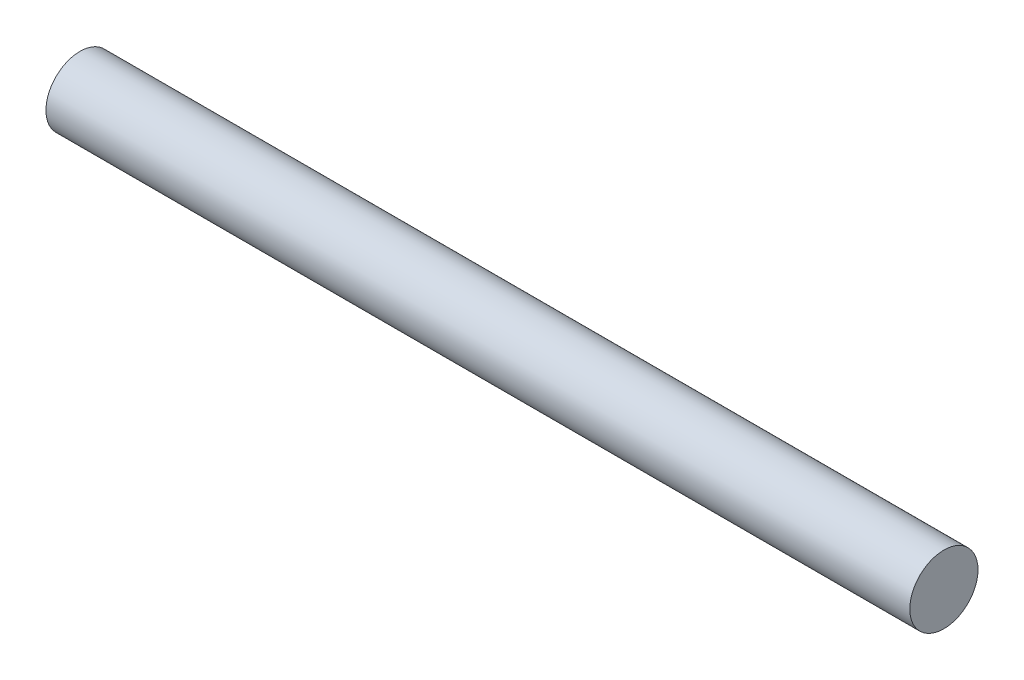
ISO-10303-21;
HEADER;
FILE_DESCRIPTION(('STEP AP214'),'2;1');
FILE_NAME('part.step','',(''),(''),'','','');
FILE_SCHEMA(('AUTOMOTIVE_DESIGN { 1 0 10303 214 1 1 1 1 }'));
ENDSEC;
DATA;
#1=APPLICATION_CONTEXT('core data for automotive mechanical design processes');
#2=APPLICATION_PROTOCOL_DEFINITION('international standard','automotive_design',2000,#1);
#3=PRODUCT_CONTEXT('',#1,'mechanical');
#4=PRODUCT('Part','Part','',(#3));
#5=PRODUCT_RELATED_PRODUCT_CATEGORY('part','',(#4));
#6=PRODUCT_DEFINITION_FORMATION('','',#4);
#7=PRODUCT_DEFINITION_CONTEXT('part definition',#1,'design');
#8=PRODUCT_DEFINITION('design','',#6,#7);
#9=PRODUCT_DEFINITION_SHAPE('','',#8);
#10=(LENGTH_UNIT() NAMED_UNIT(*) SI_UNIT(.MILLI.,.METRE.));
#11=(NAMED_UNIT(*) PLANE_ANGLE_UNIT() SI_UNIT($,.RADIAN.));
#12=(NAMED_UNIT(*) SI_UNIT($,.STERADIAN.) SOLID_ANGLE_UNIT());
#13=UNCERTAINTY_MEASURE_WITH_UNIT(LENGTH_MEASURE(1.E-05),#10,'distance_accuracy_value','');
#14=(GEOMETRIC_REPRESENTATION_CONTEXT(3) GLOBAL_UNCERTAINTY_ASSIGNED_CONTEXT((#13)) GLOBAL_UNIT_ASSIGNED_CONTEXT((#10,
#11,#12)) REPRESENTATION_CONTEXT('',''));
#15=CARTESIAN_POINT('',(0.,0.,0.));
#16=DIRECTION('',(0.,0.,1.));
#17=DIRECTION('',(1.,0.,0.));
#18=AXIS2_PLACEMENT_3D('',#15,#16,#17);
#19=CARTESIAN_POINT('',(120.65,0.,0.));
#20=DIRECTION('',(-1.,0.,0.));
#21=DIRECTION('',(0.,0.,-1.));
#22=AXIS2_PLACEMENT_3D('',#19,#20,#21);
#23=CYLINDRICAL_SURFACE('',#22,4.7625);
#24=CARTESIAN_POINT('',(120.65,0.,0.));
#25=DIRECTION('',(-1.,0.,0.));
#26=DIRECTION('',(0.,0.,1.));
#27=AXIS2_PLACEMENT_3D('',#24,#25,#26);
#28=CIRCLE('',#27,4.7625);
#29=CARTESIAN_POINT('',(120.65,0.,-4.7625));
#30=VERTEX_POINT('',#29);
#31=EDGE_CURVE('E10',#30,#30,#28,.T.);
#32=CARTESIAN_POINT('',(0.,0.,0.));
#33=DIRECTION('',(-1.,0.,0.));
#34=DIRECTION('',(0.,0.,1.));
#35=AXIS2_PLACEMENT_3D('',#32,#33,#34);
#36=CIRCLE('',#35,4.7625);
#37=CARTESIAN_POINT('',(0.,0.,-4.7625));
#38=VERTEX_POINT('',#37);
#39=EDGE_CURVE('E36',#38,#38,#36,.T.);
#40=CARTESIAN_POINT('',(120.65,0.,-4.7625));
#41=CARTESIAN_POINT('',(119.393229166667,0.,-4.7625));
#42=CARTESIAN_POINT('',(118.136458333333,0.,-4.7625));
#43=CARTESIAN_POINT('',(115.622916666667,0.,-4.7625));
#44=CARTESIAN_POINT('',(114.366145833333,0.,-4.7625));
#45=CARTESIAN_POINT('',(111.852604166667,0.,-4.7625));
#46=CARTESIAN_POINT('',(110.595833333333,0.,-4.7625));
#47=CARTESIAN_POINT('',(108.082291666667,0.,-4.7625));
#48=CARTESIAN_POINT('',(106.825520833333,0.,-4.7625));
#49=CARTESIAN_POINT('',(104.311979166667,0.,-4.7625));
#50=CARTESIAN_POINT('',(103.055208333333,0.,-4.7625));
#51=CARTESIAN_POINT('',(100.541666666667,0.,-4.7625));
#52=CARTESIAN_POINT('',(99.2848958333333,0.,-4.7625));
#53=CARTESIAN_POINT('',(96.7713541666667,0.,-4.7625));
#54=CARTESIAN_POINT('',(95.5145833333333,0.,-4.7625));
#55=CARTESIAN_POINT('',(93.0010416666667,0.,-4.7625));
#56=CARTESIAN_POINT('',(91.7442708333333,0.,-4.7625));
#57=CARTESIAN_POINT('',(89.2307291666667,0.,-4.7625));
#58=CARTESIAN_POINT('',(87.9739583333333,0.,-4.7625));
#59=CARTESIAN_POINT('',(85.4604166666667,0.,-4.7625));
#60=CARTESIAN_POINT('',(84.2036458333333,0.,-4.7625));
#61=CARTESIAN_POINT('',(81.6901041666667,0.,-4.7625));
#62=CARTESIAN_POINT('',(80.4333333333333,0.,-4.7625));
#63=CARTESIAN_POINT('',(77.9197916666667,0.,-4.7625));
#64=CARTESIAN_POINT('',(76.6630208333333,0.,-4.7625));
#65=CARTESIAN_POINT('',(74.1494791666667,0.,-4.7625));
#66=CARTESIAN_POINT('',(72.8927083333333,0.,-4.7625));
#67=CARTESIAN_POINT('',(70.3791666666667,0.,-4.7625));
#68=CARTESIAN_POINT('',(69.1223958333333,0.,-4.7625));
#69=CARTESIAN_POINT('',(66.6088541666667,0.,-4.7625));
#70=CARTESIAN_POINT('',(65.3520833333333,0.,-4.7625));
#71=CARTESIAN_POINT('',(62.8385416666667,0.,-4.7625));
#72=CARTESIAN_POINT('',(61.5817708333333,0.,-4.7625));
#73=CARTESIAN_POINT('',(59.0682291666667,0.,-4.7625));
#74=CARTESIAN_POINT('',(57.8114583333333,0.,-4.7625));
#75=CARTESIAN_POINT('',(55.2979166666667,0.,-4.7625));
#76=CARTESIAN_POINT('',(54.0411458333333,0.,-4.7625));
#77=CARTESIAN_POINT('',(51.5276041666667,0.,-4.7625));
#78=CARTESIAN_POINT('',(50.2708333333333,0.,-4.7625));
#79=CARTESIAN_POINT('',(47.7572916666667,0.,-4.7625));
#80=CARTESIAN_POINT('',(46.5005208333333,0.,-4.7625));
#81=CARTESIAN_POINT('',(43.9869791666667,0.,-4.7625));
#82=CARTESIAN_POINT('',(42.7302083333333,0.,-4.7625));
#83=CARTESIAN_POINT('',(40.2166666666667,0.,-4.7625));
#84=CARTESIAN_POINT('',(38.9598958333333,0.,-4.7625));
#85=CARTESIAN_POINT('',(36.4463541666667,0.,-4.7625));
#86=CARTESIAN_POINT('',(35.1895833333333,0.,-4.7625));
#87=CARTESIAN_POINT('',(32.6760416666667,0.,-4.7625));
#88=CARTESIAN_POINT('',(31.4192708333333,0.,-4.7625));
#89=CARTESIAN_POINT('',(28.9057291666667,0.,-4.7625));
#90=CARTESIAN_POINT('',(27.6489583333333,0.,-4.7625));
#91=CARTESIAN_POINT('',(25.1354166666667,0.,-4.7625));
#92=CARTESIAN_POINT('',(23.8786458333333,0.,-4.7625));
#93=CARTESIAN_POINT('',(21.3651041666667,0.,-4.7625));
#94=CARTESIAN_POINT('',(20.1083333333333,0.,-4.7625));
#95=CARTESIAN_POINT('',(17.5947916666667,0.,-4.7625));
#96=CARTESIAN_POINT('',(16.3380208333333,0.,-4.7625));
#97=CARTESIAN_POINT('',(13.8244791666667,0.,-4.7625));
#98=CARTESIAN_POINT('',(12.5677083333333,0.,-4.7625));
#99=CARTESIAN_POINT('',(10.0541666666667,0.,-4.7625));
#100=CARTESIAN_POINT('',(8.79739583333333,0.,-4.7625));
#101=CARTESIAN_POINT('',(6.28385416666666,0.,-4.7625));
#102=CARTESIAN_POINT('',(5.02708333333333,0.,-4.7625));
#103=CARTESIAN_POINT('',(2.51354166666666,0.,-4.7625));
#104=CARTESIAN_POINT('',(1.25677083333333,0.,-4.7625));
#105=CARTESIAN_POINT('',(0.,0.,-4.7625));
#106=B_SPLINE_CURVE_WITH_KNOTS('',3,(#40,#41,#42,#43,#44,#45,#46,#47,#48,#49,#50,#51,#52,#53,
#54,#55,#56,#57,#58,#59,#60,#61,#62,#63,#64,#65,#66,#67,#68,#69,#70,#71,#72,#73,#74,#75,#76,#77,
#78,#79,#80,#81,#82,#83,#84,#85,#86,#87,#88,#89,#90,#91,#92,#93,#94,#95,#96,#97,#98,#99,#100,
#101,#102,#103,#104,#105),.UNSPECIFIED.,.F.,.F.,(4,2,2,2,2,2,2,2,2,2,2,2,2,2,2,2,2,2,2,2,2,2,2,
2,2,2,2,2,2,2,2,2,4),(0.,3.77031250000001,7.54062500000001,11.3109375,15.08125,18.8515625,
22.621875,26.3921875,30.1625,33.9328125,37.703125,41.4734375,45.24375,49.0140625,52.784375,
56.5546875,60.325,64.0953125,67.865625,71.6359375,75.40625,79.1765625,82.946875,86.7171875,
90.4875,94.2578125,98.028125,101.7984375,105.56875,109.3390625,113.109375,116.8796875,120.65),.UNSPECIFIED.);
#107=EDGE_CURVE('BSEAM33',#30,#38,#106,.T.);
#108=ORIENTED_EDGE('',*,*,#31,.T.);
#109=ORIENTED_EDGE('',*,*,#39,.F.);
#110=ORIENTED_EDGE('',*,*,#107,.T.);
#111=ORIENTED_EDGE('',*,*,#107,.F.);
#112=EDGE_LOOP('',(#108,#110,#109,#111));
#113=FACE_BOUND('',#112,.T.);
#114=ADVANCED_FACE('F33',(#113),#23,.T.);
#115=CARTESIAN_POINT('',(120.65,0.,0.));
#116=DIRECTION('',(1.,0.,0.));
#117=DIRECTION('',(0.,0.,1.));
#118=AXIS2_PLACEMENT_3D('',#115,#116,#117);
#119=PLANE('',#118);
#120=ORIENTED_EDGE('',*,*,#31,.F.);
#121=EDGE_LOOP('',(#120));
#122=FACE_BOUND('',#121,.T.);
#123=ADVANCED_FACE('F48',(#122),#119,.T.);
#124=CARTESIAN_POINT('',(0.,0.,0.));
#125=DIRECTION('',(1.,0.,0.));
#126=DIRECTION('',(0.,0.,1.));
#127=AXIS2_PLACEMENT_3D('',#124,#125,#126);
#128=PLANE('',#127);
#129=ORIENTED_EDGE('',*,*,#39,.T.);
#130=EDGE_LOOP('',(#129));
#131=FACE_BOUND('',#130,.T.);
#132=ADVANCED_FACE('F45',(#131),#128,.F.);
#133=CLOSED_SHELL('',(#114,#123,#132));
#134=MANIFOLD_SOLID_BREP('B2',#133);
#135=ADVANCED_BREP_SHAPE_REPRESENTATION('',(#18,#134),#14);
#136=SHAPE_DEFINITION_REPRESENTATION(#9,#135);
ENDSEC;
END-ISO-10303-21;
